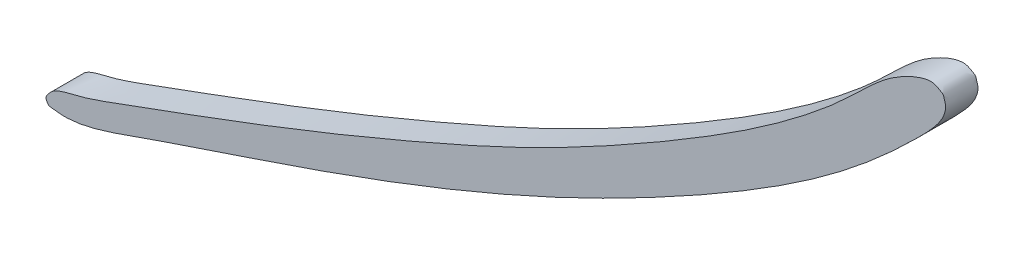
ISO-10303-21;
HEADER;
FILE_DESCRIPTION(('STEP AP214'),'2;1');
FILE_NAME('part.step','',(''),(''),'','','');
FILE_SCHEMA(('AUTOMOTIVE_DESIGN { 1 0 10303 214 1 1 1 1 }'));
ENDSEC;
DATA;
#1=APPLICATION_CONTEXT('core data for automotive mechanical design processes');
#2=APPLICATION_PROTOCOL_DEFINITION('international standard','automotive_design',2000,#1);
#3=PRODUCT_CONTEXT('',#1,'mechanical');
#4=PRODUCT('Part','Part','',(#3));
#5=PRODUCT_RELATED_PRODUCT_CATEGORY('part','',(#4));
#6=PRODUCT_DEFINITION_FORMATION('','',#4);
#7=PRODUCT_DEFINITION_CONTEXT('part definition',#1,'design');
#8=PRODUCT_DEFINITION('design','',#6,#7);
#9=PRODUCT_DEFINITION_SHAPE('','',#8);
#10=(LENGTH_UNIT() NAMED_UNIT(*) SI_UNIT(.MILLI.,.METRE.));
#11=(NAMED_UNIT(*) PLANE_ANGLE_UNIT() SI_UNIT($,.RADIAN.));
#12=(NAMED_UNIT(*) SI_UNIT($,.STERADIAN.) SOLID_ANGLE_UNIT());
#13=UNCERTAINTY_MEASURE_WITH_UNIT(LENGTH_MEASURE(1.E-05),#10,'distance_accuracy_value','');
#14=(GEOMETRIC_REPRESENTATION_CONTEXT(3) GLOBAL_UNCERTAINTY_ASSIGNED_CONTEXT((#13)) GLOBAL_UNIT_ASSIGNED_CONTEXT((#10,
#11,#12)) REPRESENTATION_CONTEXT('',''));
#15=CARTESIAN_POINT('',(0.,0.,0.));
#16=DIRECTION('',(0.,0.,1.));
#17=DIRECTION('',(1.,0.,0.));
#18=AXIS2_PLACEMENT_3D('',#15,#16,#17);
#19=CARTESIAN_POINT('',(102.057733307676,0.,140.));
#20=CARTESIAN_POINT('',(101.962676141197,0.142516644317839,140.));
#21=CARTESIAN_POINT('',(101.821941702377,0.24010677990998,140.));
#22=CARTESIAN_POINT('',(101.535030322665,0.418667279109253,140.));
#23=CARTESIAN_POINT('',(101.386294801414,0.498837562727453,140.));
#24=CARTESIAN_POINT('',(101.092939539661,0.666279611016921,140.));
#25=CARTESIAN_POINT('',(100.947667564728,0.752425992501434,140.));
#26=CARTESIAN_POINT('',(100.650509262064,0.913306169634957,140.));
#27=CARTESIAN_POINT('',(100.499177263178,0.988329365892847,140.));
#28=CARTESIAN_POINT('',(100.191666683993,1.12215752572723,140.));
#29=CARTESIAN_POINT('',(100.034994525604,1.18058485724746,140.));
#30=CARTESIAN_POINT('',(99.7111281294442,1.26682510236769,140.));
#31=CARTESIAN_POINT('',(99.5427705351879,1.29581185455209,140.));
#32=CARTESIAN_POINT('',(99.0366140120345,1.34446390544908,140.));
#33=CARTESIAN_POINT('',(98.7015714964061,1.32743816267723,140.));
#34=CARTESIAN_POINT('',(98.0338138981081,1.24532493808534,140.));
#35=CARTESIAN_POINT('',(97.7009011280452,1.1785990423327,140.));
#36=CARTESIAN_POINT('',(97.0480807716276,1.02268907596653,140.));
#37=CARTESIAN_POINT('',(96.7263196816451,0.931947806175763,140.));
#38=CARTESIAN_POINT('',(95.7733663415602,0.62581325787824,140.));
#39=CARTESIAN_POINT('',(95.1533423115266,0.379704265719774,140.));
#40=CARTESIAN_POINT('',(93.9278177514043,-0.152457385786442,140.));
#41=CARTESIAN_POINT('',(93.3216382307498,-0.442437948989211,140.));
#42=CARTESIAN_POINT('',(92.1336428585738,-1.05752382836864,140.));
#43=CARTESIAN_POINT('',(91.551936655469,-1.38178134880864,140.));
#44=CARTESIAN_POINT('',(89.8410991984617,-2.40117115633311,140.));
#45=CARTESIAN_POINT('',(88.748132347433,-3.145481629072,140.));
#46=CARTESIAN_POINT('',(85.6046288443026,-5.56253280956003,140.));
#47=CARTESIAN_POINT('',(83.676333240927,-7.40170155492786,140.));
#48=CARTESIAN_POINT('',(80.8008864217277,-10.1827260597335,140.));
#49=CARTESIAN_POINT('',(79.8434632554264,-11.1111501086519,140.));
#50=CARTESIAN_POINT('',(77.9094426741411,-12.9423648628248,140.));
#51=CARTESIAN_POINT('',(76.9345108605818,-13.8473822490008,140.));
#52=CARTESIAN_POINT('',(73.9682368812663,-16.506983283827,140.));
#53=CARTESIAN_POINT('',(71.9382678261279,-18.2099280731618,140.));
#54=CARTESIAN_POINT('',(67.8100442077678,-21.5245292824694,140.));
#55=CARTESIAN_POINT('',(65.7117213207824,-23.1360943629306,140.));
#56=CARTESIAN_POINT('',(61.4641506556757,-26.2911449209881,140.));
#57=CARTESIAN_POINT('',(59.3130472963583,-27.8321497407355,140.));
#58=CARTESIAN_POINT('',(54.9577964188229,-30.8432466066985,140.));
#59=CARTESIAN_POINT('',(52.75463560697,-32.314657744148,140.));
#60=CARTESIAN_POINT('',(48.3089080789626,-35.2047997235071,140.));
#61=CARTESIAN_POINT('',(46.0664851938051,-36.6237228477552,140.));
#62=CARTESIAN_POINT('',(41.5526254908894,-39.4227814432014,140.));
#63=CARTESIAN_POINT('',(39.2802080198432,-40.8028726390609,140.));
#64=CARTESIAN_POINT('',(32.4308879126295,-44.8901584419507,140.));
#65=CARTESIAN_POINT('',(27.8223787288117,-47.5443673312823,140.));
#66=CARTESIAN_POINT('',(18.5400631658067,-52.7320945639716,140.));
#67=CARTESIAN_POINT('',(13.8663029099355,-55.2650712351752,140.));
#68=CARTESIAN_POINT('',(4.43178301771482,-60.1685483665272,140.));
#69=CARTESIAN_POINT('',(-0.332083154591981,-62.5354473233724,140.));
#70=CARTESIAN_POINT('',(-9.93624818092265,-67.0972649941052,140.));
#71=CARTESIAN_POINT('',(-14.777734120957,-69.2932642124302,140.));
#72=CARTESIAN_POINT('',(-24.506189615508,-73.5872509634414,140.));
#73=CARTESIAN_POINT('',(-29.3913556935983,-75.6875684559242,140.));
#74=CARTESIAN_POINT('',(-39.1877424269124,-79.8238595987676,140.));
#75=CARTESIAN_POINT('',(-44.099759835072,-81.8596834877531,140.));
#76=CARTESIAN_POINT('',(-53.9584554310622,-85.847040334263,140.));
#77=CARTESIAN_POINT('',(-58.9047472520571,-87.7972891259917,140.));
#78=CARTESIAN_POINT('',(-68.8263537446599,-91.6233975453181,140.));
#79=CARTESIAN_POINT('',(-73.8013270461344,-93.5003970761533,140.));
#80=CARTESIAN_POINT('',(-81.2739052523245,-96.2886358795814,140.));
#81=CARTESIAN_POINT('',(-83.7663990247296,-97.2136662720909,140.));
#82=CARTESIAN_POINT('',(-88.7521676174373,-99.0616086376601,140.));
#83=CARTESIAN_POINT('',(-91.2454447186618,-99.9845238785492,140.));
#84=CARTESIAN_POINT('',(-96.2347103566942,-101.82299836821,140.));
#85=CARTESIAN_POINT('',(-98.7309301209679,-102.73794484647,140.));
#86=CARTESIAN_POINT('',(-102.479303181382,-104.099222107488,140.));
#87=CARTESIAN_POINT('',(-103.728682282879,-104.553198484821,140.));
#88=CARTESIAN_POINT('',(-106.231827459639,-105.449021148113,140.));
#89=CARTESIAN_POINT('',(-107.486907124822,-105.886799692826,140.));
#90=CARTESIAN_POINT('',(-110.018323693571,-106.688455667058,140.));
#91=CARTESIAN_POINT('',(-111.294468980965,-107.05373464731,140.));
#92=CARTESIAN_POINT('',(-113.228708101294,-107.533459844928,140.));
#93=CARTESIAN_POINT('',(-113.876376303375,-107.683416334939,140.));
#94=CARTESIAN_POINT('',(-115.159808459549,-108.023875838968,140.));
#95=CARTESIAN_POINT('',(-115.796585709176,-108.211082080298,140.));
#96=CARTESIAN_POINT('',(-116.720341410338,-108.570387874491,140.));
#97=CARTESIAN_POINT('',(-117.022690877312,-108.704511531072,140.));
#98=CARTESIAN_POINT('',(-117.607895975314,-109.023006667351,140.));
#99=CARTESIAN_POINT('',(-117.886592166604,-109.206094192118,140.));
#100=CARTESIAN_POINT('',(-118.388037415295,-109.627595019604,140.));
#101=CARTESIAN_POINT('',(-118.61437727197,-109.865589485727,140.));
#102=CARTESIAN_POINT('',(-118.932477248965,-110.246503404859,140.));
#103=CARTESIAN_POINT('',(-119.034205275818,-110.378292267774,140.));
#104=CARTESIAN_POINT('',(-119.236541038944,-110.641716636127,140.));
#105=CARTESIAN_POINT('',(-119.337825602485,-110.773347395761,140.));
#106=CARTESIAN_POINT('',(-119.518799463527,-111.051678805721,140.));
#107=CARTESIAN_POINT('',(-119.602114066893,-111.201877195743,140.));
#108=CARTESIAN_POINT('',(-119.648215340564,-111.535584809531,140.));
#109=CARTESIAN_POINT('',(-119.608346981636,-111.70434587511,140.));
#110=CARTESIAN_POINT('',(-119.493582657096,-112.015542970277,140.));
#111=CARTESIAN_POINT('',(-119.421734302809,-112.16507824468,140.));
#112=CARTESIAN_POINT('',(-119.301432101046,-112.384129545218,140.));
#113=CARTESIAN_POINT('',(-119.258518092987,-112.455602565269,140.));
#114=CARTESIAN_POINT('',(-119.163389076837,-112.59180522141,140.));
#115=CARTESIAN_POINT('',(-119.110042110579,-112.657209740684,140.));
#116=CARTESIAN_POINT('',(-118.988075313533,-112.769368957982,140.));
#117=CARTESIAN_POINT('',(-118.918727406085,-112.817162055145,140.));
#118=CARTESIAN_POINT('',(-118.768831348743,-112.889069636095,140.));
#119=CARTESIAN_POINT('',(-118.689027826353,-112.911724668703,140.));
#120=CARTESIAN_POINT('',(-118.443026205126,-112.958296532501,140.));
#121=CARTESIAN_POINT('',(-118.276588644351,-112.964481115223,140.));
#122=CARTESIAN_POINT('',(-117.778801575783,-112.998603156016,140.));
#123=CARTESIAN_POINT('',(-117.44866238398,-113.037673658146,140.));
#124=CARTESIAN_POINT('',(-116.788188102577,-113.121133681609,140.));
#125=CARTESIAN_POINT('',(-116.457962102576,-113.165194724771,140.));
#126=CARTESIAN_POINT('',(-115.797359763013,-113.221860420003,140.));
#127=CARTESIAN_POINT('',(-115.466985822682,-113.234967076981,140.));
#128=CARTESIAN_POINT('',(-114.475695765086,-113.239085957723,140.));
#129=CARTESIAN_POINT('',(-113.814618353362,-113.196349636067,140.));
#130=CARTESIAN_POINT('',(-112.492254325882,-113.067104058087,140.));
#131=CARTESIAN_POINT('',(-111.831495728637,-112.979194331104,140.));
#132=CARTESIAN_POINT('',(-110.525918678127,-112.7632285738,140.));
#133=CARTESIAN_POINT('',(-109.878981356204,-112.634835257558,140.));
#134=CARTESIAN_POINT('',(-107.952833541055,-112.198503141662,140.));
#135=CARTESIAN_POINT('',(-106.687694809474,-111.841478573406,140.));
#136=CARTESIAN_POINT('',(-104.173016510138,-111.073015713485,140.));
#137=CARTESIAN_POINT('',(-102.923874901132,-110.660189243739,140.));
#138=CARTESIAN_POINT('',(-99.186048980755,-109.388226485225,140.));
#139=CARTESIAN_POINT('',(-96.7048470391096,-108.503456947671,140.));
#140=CARTESIAN_POINT('',(-91.7338401473932,-106.761691871831,140.));
#141=CARTESIAN_POINT('',(-89.2453108158727,-105.899386574664,140.));
#142=CARTESIAN_POINT('',(-81.7674895326809,-103.348392865064,140.));
#143=CARTESIAN_POINT('',(-76.7690399043289,-101.686710939639,140.));
#144=CARTESIAN_POINT('',(-66.7794608125337,-98.3420297338285,140.));
#145=CARTESIAN_POINT('',(-61.7878155794341,-96.6605676486596,140.));
#146=CARTESIAN_POINT('',(-46.8522683981065,-91.5019174216151,140.));
#147=CARTESIAN_POINT('',(-36.9467309109251,-87.908197944574,140.));
#148=CARTESIAN_POINT('',(-22.2294430761429,-82.1619343514593,140.));
#149=CARTESIAN_POINT('',(-17.3460317200841,-80.1868058744148,140.));
#150=CARTESIAN_POINT('',(-7.63373774164566,-76.1049596199435,140.));
#151=CARTESIAN_POINT('',(-2.80692055683079,-73.9991204608374,140.));
#152=CARTESIAN_POINT('',(11.5703617704928,-67.4532572112962,140.));
#153=CARTESIAN_POINT('',(21.0233270248259,-62.7850317350021,140.));
#154=CARTESIAN_POINT('',(34.9807224476126,-55.3764898608674,140.));
#155=CARTESIAN_POINT('',(39.5922357870787,-52.8430342290804,140.));
#156=CARTESIAN_POINT('',(48.722455352081,-47.6312150008303,140.));
#157=CARTESIAN_POINT('',(53.241786538152,-44.9538272105877,140.));
#158=CARTESIAN_POINT('',(62.1460169830506,-39.3891511586884,140.));
#159=CARTESIAN_POINT('',(66.5302023875438,-36.5007482930509,140.));
#160=CARTESIAN_POINT('',(75.0925308524823,-30.4022304057901,140.));
#161=CARTESIAN_POINT('',(79.2688872930178,-27.1889854464808,140.));
#162=CARTESIAN_POINT('',(85.3435053638941,-22.0736074220783,140.));
#163=CARTESIAN_POINT('',(87.3303562392506,-20.3256183322959,140.));
#164=CARTESIAN_POINT('',(91.234859362927,-16.7516305573011,140.));
#165=CARTESIAN_POINT('',(93.1541851384151,-14.9280868951107,140.));
#166=CARTESIAN_POINT('',(95.9837594093325,-12.142691409223,140.));
#167=CARTESIAN_POINT('',(96.9190657243905,-11.2061302073817,140.));
#168=CARTESIAN_POINT('',(98.2900691043272,-9.7705527381082,140.));
#169=CARTESIAN_POINT('',(98.74077637573,-9.28522457741888,140.));
#170=CARTESIAN_POINT('',(99.6176822654926,-8.29504460302253,140.));
#171=CARTESIAN_POINT('',(100.045142501861,-7.79125220272016,140.));
#172=CARTESIAN_POINT('',(100.851408348022,-6.74514981026008,140.));
#173=CARTESIAN_POINT('',(101.232029632026,-6.20058231509911,140.));
#174=CARTESIAN_POINT('',(101.733723703415,-5.34210590975484,140.));
#175=CARTESIAN_POINT('',(101.888607892713,-5.04974645526602,140.));
#176=CARTESIAN_POINT('',(102.165860600153,-4.44869842635026,140.));
#177=CARTESIAN_POINT('',(102.288522969304,-4.13834481496648,140.));
#178=CARTESIAN_POINT('',(102.493253885496,-3.50824972925251,140.));
#179=CARTESIAN_POINT('',(102.575182631375,-3.18848595898934,140.));
#180=CARTESIAN_POINT('',(102.645792314535,-2.69677473406768,140.));
#181=CARTESIAN_POINT('',(102.660388952861,-2.52919459256812,140.));
#182=CARTESIAN_POINT('',(102.665394982944,-2.19717752690158,140.));
#183=CARTESIAN_POINT('',(102.656086130014,-2.03345252852174,140.));
#184=CARTESIAN_POINT('',(102.581581694767,-1.55128222137112,140.));
#185=CARTESIAN_POINT('',(102.472222393365,-1.241374882578,140.));
#186=CARTESIAN_POINT('',(102.318443008268,-0.774530439186348,140.));
#187=CARTESIAN_POINT('',(102.274459928558,-0.617039558874887,140.));
#188=CARTESIAN_POINT('',(102.209966655229,-0.379987776887736,140.));
#189=CARTESIAN_POINT('',(102.189036118981,-0.300779113975077,140.));
#190=CARTESIAN_POINT('',(102.136534605629,-0.145952280092756,140.));
#191=CARTESIAN_POINT('',(102.105261890916,-0.0712583221589129,140.));
#192=CARTESIAN_POINT('',(102.057733307676,0.,140.));
#193=B_SPLINE_CURVE_WITH_KNOTS('',3,(#19,#20,#21,#22,#23,#24,#25,#26,#27,#28,#29,#30,#31,#32,
#33,#34,#35,#36,#37,#38,#39,#40,#41,#42,#43,#44,#45,#46,#47,#48,#49,#50,#51,#52,#53,#54,#55,#56,
#57,#58,#59,#60,#61,#62,#63,#64,#65,#66,#67,#68,#69,#70,#71,#72,#73,#74,#75,#76,#77,#78,#79,#80,
#81,#82,#83,#84,#85,#86,#87,#88,#89,#90,#91,#92,#93,#94,#95,#96,#97,#98,#99,#100,#101,#102,#103,
#104,#105,#106,#107,#108,#109,#110,#111,#112,#113,#114,#115,#116,#117,#118,#119,#120,#121,#122,
#123,#124,#125,#126,#127,#128,#129,#130,#131,#132,#133,#134,#135,#136,#137,#138,#139,#140,#141,
#142,#143,#144,#145,#146,#147,#148,#149,#150,#151,#152,#153,#154,#155,#156,#157,#158,#159,#160,
#161,#162,#163,#164,#165,#166,#167,#168,#169,#170,#171,#172,#173,#174,#175,#176,#177,#178,#179,
#180,#181,#182,#183,#184,#185,#186,#187,#188,#189,#190,#191,#192),.UNSPECIFIED.,.T.,.F.,(4,2,2,
2,2,2,2,2,2,2,2,2,2,2,2,2,2,2,2,2,2,2,2,2,2,2,2,2,2,2,2,2,2,2,2,2,2,2,2,2,2,2,2,2,2,2,2,2,2,2,2,
2,2,2,2,2,2,2,2,2,2,2,2,2,2,2,2,2,2,2,2,2,2,2,2,2,2,2,2,2,2,2,2,2,2,2,4),(0.,
0.000976562499999994,0.00195312499999999,0.00292968749999998,0.00390624999999998,
0.00488281249999997,0.00585937499999996,0.00781249999999995,0.00976562499999994,
0.0117187499999999,0.015625,0.01953125,0.0234375000000001,0.0312500000000001,0.0468750000000002,
0.0546875000000002,0.0625000000000002,0.0781250000000002,0.0937500000000001,0.109375,0.125,
0.140625,0.15625,0.1875,0.21875,0.25,0.28125,0.3125,0.343749999999999,0.374999999999999,
0.406249999999999,0.421874999999999,0.437499999999999,0.453124999999999,0.460937499999999,
0.468749999999999,0.476562499999999,0.480468749999999,0.484374999999999,0.486328124999999,
0.488281249999999,0.490234374999999,0.491210937499999,0.492187499999999,0.493164062499999,
0.494140624999999,0.495117187499999,0.495605468749999,0.496093749999999,0.496582031249999,
0.497070312499999,0.498046874999999,0.499999999999999,0.501953124999999,0.503906249999999,
0.507812499999999,0.511718749999999,0.515624999999999,0.523437499999999,0.531249999999999,
0.546874999999999,0.562499999999999,0.593749999999999,0.624999999999999,0.687499999999999,
0.718749999999999,0.749999999999999,0.8125,0.84375,0.875,0.90625,0.9375,0.953125,0.96875,
0.9765625,0.98046875,0.984375,0.98828125,0.990234375,0.9921875,0.994140625,0.9951171875,
0.99609375,0.998046875,0.9990234375,0.99951171875,1.),.UNSPECIFIED.);
#194=DIRECTION('',(0.,0.,-1.));
#195=VECTOR('',#194,1.);
#196=SURFACE_OF_LINEAR_EXTRUSION('',#193,#195);
#197=CARTESIAN_POINT('',(102.057733307676,0.,140.));
#198=CARTESIAN_POINT('',(102.105261890916,-0.0712583221589129,140.));
#199=CARTESIAN_POINT('',(102.136534605629,-0.145952280092756,140.));
#200=CARTESIAN_POINT('',(102.189036118981,-0.300779113975077,140.));
#201=CARTESIAN_POINT('',(102.209966655229,-0.379987776887736,140.));
#202=CARTESIAN_POINT('',(102.274459928558,-0.617039558874887,140.));
#203=CARTESIAN_POINT('',(102.318443008268,-0.774530439186348,140.));
#204=CARTESIAN_POINT('',(102.472222393365,-1.241374882578,140.));
#205=CARTESIAN_POINT('',(102.581581694767,-1.55128222137112,140.));
#206=CARTESIAN_POINT('',(102.656086130014,-2.03345252852174,140.));
#207=CARTESIAN_POINT('',(102.665394982944,-2.19717752690158,140.));
#208=CARTESIAN_POINT('',(102.660388952861,-2.52919459256812,140.));
#209=CARTESIAN_POINT('',(102.645792314535,-2.69677473406768,140.));
#210=CARTESIAN_POINT('',(102.575182631375,-3.18848595898934,140.));
#211=CARTESIAN_POINT('',(102.493253885496,-3.50824972925251,140.));
#212=CARTESIAN_POINT('',(102.288522969304,-4.13834481496648,140.));
#213=CARTESIAN_POINT('',(102.165860600153,-4.44869842635026,140.));
#214=CARTESIAN_POINT('',(101.888607892713,-5.04974645526602,140.));
#215=CARTESIAN_POINT('',(101.733723703415,-5.34210590975484,140.));
#216=CARTESIAN_POINT('',(101.232029632026,-6.20058231509911,140.));
#217=CARTESIAN_POINT('',(100.851408348022,-6.74514981026008,140.));
#218=CARTESIAN_POINT('',(100.045142501861,-7.79125220272016,140.));
#219=CARTESIAN_POINT('',(99.6176822654926,-8.29504460302253,140.));
#220=CARTESIAN_POINT('',(98.74077637573,-9.28522457741888,140.));
#221=CARTESIAN_POINT('',(98.2900691043272,-9.7705527381082,140.));
#222=CARTESIAN_POINT('',(96.9190657243905,-11.2061302073817,140.));
#223=CARTESIAN_POINT('',(95.9837594093325,-12.142691409223,140.));
#224=CARTESIAN_POINT('',(93.1541851384151,-14.9280868951107,140.));
#225=CARTESIAN_POINT('',(91.234859362927,-16.7516305573011,140.));
#226=CARTESIAN_POINT('',(87.3303562392506,-20.3256183322959,140.));
#227=CARTESIAN_POINT('',(85.3435053638941,-22.0736074220783,140.));
#228=CARTESIAN_POINT('',(79.2688872930178,-27.1889854464808,140.));
#229=CARTESIAN_POINT('',(75.0925308524823,-30.4022304057901,140.));
#230=CARTESIAN_POINT('',(66.5302023875438,-36.5007482930509,140.));
#231=CARTESIAN_POINT('',(62.1460169830506,-39.3891511586884,140.));
#232=CARTESIAN_POINT('',(53.241786538152,-44.9538272105877,140.));
#233=CARTESIAN_POINT('',(48.722455352081,-47.6312150008303,140.));
#234=CARTESIAN_POINT('',(39.5922357870787,-52.8430342290804,140.));
#235=CARTESIAN_POINT('',(34.9807224476126,-55.3764898608674,140.));
#236=CARTESIAN_POINT('',(21.0233270248259,-62.7850317350021,140.));
#237=CARTESIAN_POINT('',(11.5703617704928,-67.4532572112962,140.));
#238=CARTESIAN_POINT('',(-2.80692055683079,-73.9991204608374,140.));
#239=CARTESIAN_POINT('',(-7.63373774164566,-76.1049596199435,140.));
#240=CARTESIAN_POINT('',(-17.3460317200841,-80.1868058744148,140.));
#241=CARTESIAN_POINT('',(-22.2294430761429,-82.1619343514593,140.));
#242=CARTESIAN_POINT('',(-36.9467309109251,-87.908197944574,140.));
#243=CARTESIAN_POINT('',(-46.8522683981065,-91.5019174216151,140.));
#244=CARTESIAN_POINT('',(-61.7878155794341,-96.6605676486596,140.));
#245=CARTESIAN_POINT('',(-66.7794608125337,-98.3420297338285,140.));
#246=CARTESIAN_POINT('',(-76.7690399043289,-101.686710939639,140.));
#247=CARTESIAN_POINT('',(-81.7674895326809,-103.348392865064,140.));
#248=CARTESIAN_POINT('',(-89.2453108158727,-105.899386574664,140.));
#249=CARTESIAN_POINT('',(-91.7338401473932,-106.761691871831,140.));
#250=CARTESIAN_POINT('',(-96.7048470391096,-108.503456947671,140.));
#251=CARTESIAN_POINT('',(-99.186048980755,-109.388226485225,140.));
#252=CARTESIAN_POINT('',(-102.923874901132,-110.660189243739,140.));
#253=CARTESIAN_POINT('',(-104.173016510138,-111.073015713485,140.));
#254=CARTESIAN_POINT('',(-106.687694809474,-111.841478573406,140.));
#255=CARTESIAN_POINT('',(-107.952833541055,-112.198503141662,140.));
#256=CARTESIAN_POINT('',(-109.878981356204,-112.634835257558,140.));
#257=CARTESIAN_POINT('',(-110.525918678127,-112.7632285738,140.));
#258=CARTESIAN_POINT('',(-111.831495728637,-112.979194331104,140.));
#259=CARTESIAN_POINT('',(-112.492254325882,-113.067104058087,140.));
#260=CARTESIAN_POINT('',(-113.814618353362,-113.196349636067,140.));
#261=CARTESIAN_POINT('',(-114.475695765086,-113.239085957723,140.));
#262=CARTESIAN_POINT('',(-115.466985822682,-113.234967076981,140.));
#263=CARTESIAN_POINT('',(-115.797359763013,-113.221860420003,140.));
#264=CARTESIAN_POINT('',(-116.457962102576,-113.165194724771,140.));
#265=CARTESIAN_POINT('',(-116.788188102577,-113.121133681609,140.));
#266=CARTESIAN_POINT('',(-117.44866238398,-113.037673658146,140.));
#267=CARTESIAN_POINT('',(-117.778801575783,-112.998603156016,140.));
#268=CARTESIAN_POINT('',(-118.276588644351,-112.964481115223,140.));
#269=CARTESIAN_POINT('',(-118.443026205126,-112.958296532501,140.));
#270=CARTESIAN_POINT('',(-118.689027826353,-112.911724668703,140.));
#271=CARTESIAN_POINT('',(-118.768831348743,-112.889069636095,140.));
#272=CARTESIAN_POINT('',(-118.918727406085,-112.817162055145,140.));
#273=CARTESIAN_POINT('',(-118.988075313533,-112.769368957982,140.));
#274=CARTESIAN_POINT('',(-119.110042110579,-112.657209740684,140.));
#275=CARTESIAN_POINT('',(-119.163389076837,-112.59180522141,140.));
#276=CARTESIAN_POINT('',(-119.258518092987,-112.455602565269,140.));
#277=CARTESIAN_POINT('',(-119.301432101046,-112.384129545218,140.));
#278=CARTESIAN_POINT('',(-119.421734302809,-112.16507824468,140.));
#279=CARTESIAN_POINT('',(-119.493582657096,-112.015542970277,140.));
#280=CARTESIAN_POINT('',(-119.608346981636,-111.70434587511,140.));
#281=CARTESIAN_POINT('',(-119.648215340564,-111.535584809531,140.));
#282=CARTESIAN_POINT('',(-119.602114066893,-111.201877195743,140.));
#283=CARTESIAN_POINT('',(-119.518799463527,-111.051678805721,140.));
#284=CARTESIAN_POINT('',(-119.337825602485,-110.773347395761,140.));
#285=CARTESIAN_POINT('',(-119.236541038944,-110.641716636127,140.));
#286=CARTESIAN_POINT('',(-119.034205275818,-110.378292267774,140.));
#287=CARTESIAN_POINT('',(-118.932477248965,-110.246503404859,140.));
#288=CARTESIAN_POINT('',(-118.61437727197,-109.865589485727,140.));
#289=CARTESIAN_POINT('',(-118.388037415295,-109.627595019604,140.));
#290=CARTESIAN_POINT('',(-117.886592166604,-109.206094192118,140.));
#291=CARTESIAN_POINT('',(-117.607895975314,-109.023006667351,140.));
#292=CARTESIAN_POINT('',(-117.022690877312,-108.704511531072,140.));
#293=CARTESIAN_POINT('',(-116.720341410338,-108.570387874491,140.));
#294=CARTESIAN_POINT('',(-115.796585709176,-108.211082080298,140.));
#295=CARTESIAN_POINT('',(-115.159808459549,-108.023875838968,140.));
#296=CARTESIAN_POINT('',(-113.876376303375,-107.683416334939,140.));
#297=CARTESIAN_POINT('',(-113.228708101294,-107.533459844928,140.));
#298=CARTESIAN_POINT('',(-111.294468980965,-107.05373464731,140.));
#299=CARTESIAN_POINT('',(-110.018323693571,-106.688455667058,140.));
#300=CARTESIAN_POINT('',(-107.486907124822,-105.886799692826,140.));
#301=CARTESIAN_POINT('',(-106.231827459639,-105.449021148113,140.));
#302=CARTESIAN_POINT('',(-103.728682282879,-104.553198484821,140.));
#303=CARTESIAN_POINT('',(-102.479303181382,-104.099222107488,140.));
#304=CARTESIAN_POINT('',(-98.7309301209679,-102.73794484647,140.));
#305=CARTESIAN_POINT('',(-96.2347103566942,-101.82299836821,140.));
#306=CARTESIAN_POINT('',(-91.2454447186618,-99.9845238785492,140.));
#307=CARTESIAN_POINT('',(-88.7521676174373,-99.0616086376601,140.));
#308=CARTESIAN_POINT('',(-83.7663990247296,-97.2136662720909,140.));
#309=CARTESIAN_POINT('',(-81.2739052523245,-96.2886358795814,140.));
#310=CARTESIAN_POINT('',(-73.8013270461344,-93.5003970761533,140.));
#311=CARTESIAN_POINT('',(-68.8263537446599,-91.6233975453181,140.));
#312=CARTESIAN_POINT('',(-58.9047472520571,-87.7972891259917,140.));
#313=CARTESIAN_POINT('',(-53.9584554310622,-85.847040334263,140.));
#314=CARTESIAN_POINT('',(-44.099759835072,-81.8596834877531,140.));
#315=CARTESIAN_POINT('',(-39.1877424269124,-79.8238595987676,140.));
#316=CARTESIAN_POINT('',(-29.3913556935983,-75.6875684559242,140.));
#317=CARTESIAN_POINT('',(-24.506189615508,-73.5872509634414,140.));
#318=CARTESIAN_POINT('',(-14.777734120957,-69.2932642124302,140.));
#319=CARTESIAN_POINT('',(-9.93624818092265,-67.0972649941052,140.));
#320=CARTESIAN_POINT('',(-0.332083154591981,-62.5354473233724,140.));
#321=CARTESIAN_POINT('',(4.43178301771482,-60.1685483665272,140.));
#322=CARTESIAN_POINT('',(13.8663029099355,-55.2650712351752,140.));
#323=CARTESIAN_POINT('',(18.5400631658067,-52.7320945639716,140.));
#324=CARTESIAN_POINT('',(27.8223787288117,-47.5443673312823,140.));
#325=CARTESIAN_POINT('',(32.4308879126295,-44.8901584419507,140.));
#326=CARTESIAN_POINT('',(39.2802080198432,-40.8028726390609,140.));
#327=CARTESIAN_POINT('',(41.5526254908894,-39.4227814432014,140.));
#328=CARTESIAN_POINT('',(46.0664851938051,-36.6237228477552,140.));
#329=CARTESIAN_POINT('',(48.3089080789626,-35.2047997235071,140.));
#330=CARTESIAN_POINT('',(52.75463560697,-32.314657744148,140.));
#331=CARTESIAN_POINT('',(54.9577964188229,-30.8432466066985,140.));
#332=CARTESIAN_POINT('',(59.3130472963583,-27.8321497407355,140.));
#333=CARTESIAN_POINT('',(61.4641506556757,-26.2911449209881,140.));
#334=CARTESIAN_POINT('',(65.7117213207824,-23.1360943629306,140.));
#335=CARTESIAN_POINT('',(67.8100442077678,-21.5245292824694,140.));
#336=CARTESIAN_POINT('',(71.9382678261279,-18.2099280731618,140.));
#337=CARTESIAN_POINT('',(73.9682368812663,-16.506983283827,140.));
#338=CARTESIAN_POINT('',(76.9345108605818,-13.8473822490008,140.));
#339=CARTESIAN_POINT('',(77.9094426741411,-12.9423648628248,140.));
#340=CARTESIAN_POINT('',(79.8434632554264,-11.1111501086519,140.));
#341=CARTESIAN_POINT('',(80.8008864217277,-10.1827260597335,140.));
#342=CARTESIAN_POINT('',(83.676333240927,-7.40170155492786,140.));
#343=CARTESIAN_POINT('',(85.6046288443026,-5.56253280956003,140.));
#344=CARTESIAN_POINT('',(88.748132347433,-3.145481629072,140.));
#345=CARTESIAN_POINT('',(89.8410991984617,-2.40117115633311,140.));
#346=CARTESIAN_POINT('',(91.551936655469,-1.38178134880864,140.));
#347=CARTESIAN_POINT('',(92.1336428585738,-1.05752382836864,140.));
#348=CARTESIAN_POINT('',(93.3216382307498,-0.442437948989211,140.));
#349=CARTESIAN_POINT('',(93.9278177514043,-0.152457385786442,140.));
#350=CARTESIAN_POINT('',(95.1533423115266,0.379704265719774,140.));
#351=CARTESIAN_POINT('',(95.7733663415602,0.62581325787824,140.));
#352=CARTESIAN_POINT('',(96.7263196816451,0.931947806175763,140.));
#353=CARTESIAN_POINT('',(97.0480807716276,1.02268907596653,140.));
#354=CARTESIAN_POINT('',(97.7009011280452,1.1785990423327,140.));
#355=CARTESIAN_POINT('',(98.0338138981081,1.24532493808534,140.));
#356=CARTESIAN_POINT('',(98.7015714964061,1.32743816267723,140.));
#357=CARTESIAN_POINT('',(99.0366140120345,1.34446390544908,140.));
#358=CARTESIAN_POINT('',(99.5427705351879,1.29581185455209,140.));
#359=CARTESIAN_POINT('',(99.7111281294442,1.26682510236769,140.));
#360=CARTESIAN_POINT('',(100.034994525604,1.18058485724746,140.));
#361=CARTESIAN_POINT('',(100.191666683993,1.12215752572723,140.));
#362=CARTESIAN_POINT('',(100.499177263178,0.988329365892847,140.));
#363=CARTESIAN_POINT('',(100.650509262064,0.913306169634957,140.));
#364=CARTESIAN_POINT('',(100.947667564728,0.752425992501434,140.));
#365=CARTESIAN_POINT('',(101.092939539661,0.666279611016921,140.));
#366=CARTESIAN_POINT('',(101.386294801414,0.498837562727453,140.));
#367=CARTESIAN_POINT('',(101.535030322665,0.418667279109253,140.));
#368=CARTESIAN_POINT('',(101.821941702377,0.24010677990998,140.));
#369=CARTESIAN_POINT('',(101.962676141197,0.142516644317839,140.));
#370=CARTESIAN_POINT('',(102.057733307676,0.,140.));
#371=B_SPLINE_CURVE_WITH_KNOTS('',3,(#197,#198,#199,#200,#201,#202,#203,#204,#205,#206,#207,
#208,#209,#210,#211,#212,#213,#214,#215,#216,#217,#218,#219,#220,#221,#222,#223,#224,#225,#226,
#227,#228,#229,#230,#231,#232,#233,#234,#235,#236,#237,#238,#239,#240,#241,#242,#243,#244,#245,
#246,#247,#248,#249,#250,#251,#252,#253,#254,#255,#256,#257,#258,#259,#260,#261,#262,#263,#264,
#265,#266,#267,#268,#269,#270,#271,#272,#273,#274,#275,#276,#277,#278,#279,#280,#281,#282,#283,
#284,#285,#286,#287,#288,#289,#290,#291,#292,#293,#294,#295,#296,#297,#298,#299,#300,#301,#302,
#303,#304,#305,#306,#307,#308,#309,#310,#311,#312,#313,#314,#315,#316,#317,#318,#319,#320,#321,
#322,#323,#324,#325,#326,#327,#328,#329,#330,#331,#332,#333,#334,#335,#336,#337,#338,#339,#340,
#341,#342,#343,#344,#345,#346,#347,#348,#349,#350,#351,#352,#353,#354,#355,#356,#357,#358,#359,
#360,#361,#362,#363,#364,#365,#366,#367,#368,#369,#370),.UNSPECIFIED.,.T.,.F.,(4,2,2,2,2,2,2,2,
2,2,2,2,2,2,2,2,2,2,2,2,2,2,2,2,2,2,2,2,2,2,2,2,2,2,2,2,2,2,2,2,2,2,2,2,2,2,2,2,2,2,2,2,2,2,2,2,
2,2,2,2,2,2,2,2,2,2,2,2,2,2,2,2,2,2,2,2,2,2,2,2,2,2,2,2,2,2,4),(0.,0.00048828125,0.0009765625,
0.001953125,0.00390625,0.0048828125,0.005859375,0.0078125,0.00976562499999989,
0.0117187499999999,0.015625,0.0195312500000001,0.0234375000000002,0.0312500000000002,
0.0468750000000002,0.0625000000000003,0.0937500000000003,0.125,0.15625,0.1875,0.250000000000001,
0.281250000000001,0.312500000000001,0.375000000000001,0.406250000000001,0.437500000000001,
0.453125000000001,0.468750000000001,0.476562500000001,0.484375000000001,0.488281250000001,
0.492187500000001,0.496093750000001,0.498046875000001,0.500000000000001,0.501953125000001,
0.502929687500001,0.503417968750001,0.503906250000001,0.504394531250001,0.504882812500001,
0.505859375000001,0.506835937500001,0.507812500000001,0.508789062500001,0.509765625000001,
0.511718750000001,0.513671875000001,0.515625000000001,0.519531250000001,0.523437500000001,
0.531250000000001,0.539062500000001,0.546875000000001,0.562500000000001,0.578125000000001,
0.593750000000001,0.625000000000001,0.656250000000001,0.6875,0.71875,0.75,0.78125,0.8125,
0.84375,0.859375,0.875,0.890625,0.90625,0.921875,0.9375,0.9453125,0.953125,0.96875,0.9765625,
0.98046875,0.984375,0.98828125,0.990234375,0.9921875,0.994140625,0.9951171875,0.99609375,
0.9970703125,0.998046875,0.9990234375,1.),.UNSPECIFIED.);
#372=CARTESIAN_POINT('',(102.057733307676,0.,140.));
#373=VERTEX_POINT('',#372);
#374=EDGE_CURVE('E10',#373,#373,#371,.F.);
#375=ORIENTED_EDGE('',*,*,#374,.F.);
#376=EDGE_LOOP('',(#375));
#377=FACE_BOUND('',#376,.T.);
#378=CARTESIAN_POINT('',(102.057733307676,0.,132.));
#379=CARTESIAN_POINT('',(101.962676141197,0.142516644317839,132.));
#380=CARTESIAN_POINT('',(101.821941702377,0.24010677990998,132.));
#381=CARTESIAN_POINT('',(101.535030322665,0.418667279109253,132.));
#382=CARTESIAN_POINT('',(101.386294801414,0.498837562727453,132.));
#383=CARTESIAN_POINT('',(101.092939539661,0.666279611016921,132.));
#384=CARTESIAN_POINT('',(100.947667564728,0.752425992501434,132.));
#385=CARTESIAN_POINT('',(100.650509262064,0.913306169634957,132.));
#386=CARTESIAN_POINT('',(100.499177263178,0.988329365892847,132.));
#387=CARTESIAN_POINT('',(100.191666683993,1.12215752572723,132.));
#388=CARTESIAN_POINT('',(100.034994525604,1.18058485724746,132.));
#389=CARTESIAN_POINT('',(99.7111281294442,1.26682510236769,132.));
#390=CARTESIAN_POINT('',(99.5427705351879,1.29581185455209,132.));
#391=CARTESIAN_POINT('',(99.0366140120345,1.34446390544908,132.));
#392=CARTESIAN_POINT('',(98.7015714964061,1.32743816267723,132.));
#393=CARTESIAN_POINT('',(98.0338138981081,1.24532493808534,132.));
#394=CARTESIAN_POINT('',(97.7009011280452,1.1785990423327,132.));
#395=CARTESIAN_POINT('',(97.0480807716276,1.02268907596653,132.));
#396=CARTESIAN_POINT('',(96.7263196816451,0.931947806175763,132.));
#397=CARTESIAN_POINT('',(95.7733663415602,0.62581325787824,132.));
#398=CARTESIAN_POINT('',(95.1533423115266,0.379704265719774,132.));
#399=CARTESIAN_POINT('',(93.9278177514043,-0.152457385786442,132.));
#400=CARTESIAN_POINT('',(93.3216382307498,-0.442437948989211,132.));
#401=CARTESIAN_POINT('',(92.1336428585738,-1.05752382836864,132.));
#402=CARTESIAN_POINT('',(91.551936655469,-1.38178134880864,132.));
#403=CARTESIAN_POINT('',(89.8410991984617,-2.40117115633311,132.));
#404=CARTESIAN_POINT('',(88.748132347433,-3.145481629072,132.));
#405=CARTESIAN_POINT('',(85.6046288443026,-5.56253280956003,132.));
#406=CARTESIAN_POINT('',(83.676333240927,-7.40170155492786,132.));
#407=CARTESIAN_POINT('',(80.8008864217277,-10.1827260597335,132.));
#408=CARTESIAN_POINT('',(79.8434632554264,-11.1111501086519,132.));
#409=CARTESIAN_POINT('',(77.9094426741411,-12.9423648628248,132.));
#410=CARTESIAN_POINT('',(76.9345108605818,-13.8473822490008,132.));
#411=CARTESIAN_POINT('',(73.9682368812663,-16.506983283827,132.));
#412=CARTESIAN_POINT('',(71.9382678261279,-18.2099280731618,132.));
#413=CARTESIAN_POINT('',(67.8100442077678,-21.5245292824694,132.));
#414=CARTESIAN_POINT('',(65.7117213207824,-23.1360943629306,132.));
#415=CARTESIAN_POINT('',(61.4641506556757,-26.2911449209881,132.));
#416=CARTESIAN_POINT('',(59.3130472963583,-27.8321497407355,132.));
#417=CARTESIAN_POINT('',(54.9577964188229,-30.8432466066985,132.));
#418=CARTESIAN_POINT('',(52.75463560697,-32.314657744148,132.));
#419=CARTESIAN_POINT('',(48.3089080789626,-35.2047997235071,132.));
#420=CARTESIAN_POINT('',(46.0664851938051,-36.6237228477552,132.));
#421=CARTESIAN_POINT('',(41.5526254908894,-39.4227814432014,132.));
#422=CARTESIAN_POINT('',(39.2802080198432,-40.8028726390609,132.));
#423=CARTESIAN_POINT('',(32.4308879126295,-44.8901584419507,132.));
#424=CARTESIAN_POINT('',(27.8223787288117,-47.5443673312823,132.));
#425=CARTESIAN_POINT('',(18.5400631658067,-52.7320945639716,132.));
#426=CARTESIAN_POINT('',(13.8663029099355,-55.2650712351752,132.));
#427=CARTESIAN_POINT('',(4.43178301771482,-60.1685483665272,132.));
#428=CARTESIAN_POINT('',(-0.332083154591981,-62.5354473233724,132.));
#429=CARTESIAN_POINT('',(-9.93624818092265,-67.0972649941052,132.));
#430=CARTESIAN_POINT('',(-14.777734120957,-69.2932642124302,132.));
#431=CARTESIAN_POINT('',(-24.506189615508,-73.5872509634414,132.));
#432=CARTESIAN_POINT('',(-29.3913556935983,-75.6875684559242,132.));
#433=CARTESIAN_POINT('',(-39.1877424269124,-79.8238595987676,132.));
#434=CARTESIAN_POINT('',(-44.099759835072,-81.8596834877531,132.));
#435=CARTESIAN_POINT('',(-53.9584554310622,-85.847040334263,132.));
#436=CARTESIAN_POINT('',(-58.9047472520571,-87.7972891259917,132.));
#437=CARTESIAN_POINT('',(-68.8263537446599,-91.6233975453181,132.));
#438=CARTESIAN_POINT('',(-73.8013270461344,-93.5003970761533,132.));
#439=CARTESIAN_POINT('',(-81.2739052523245,-96.2886358795814,132.));
#440=CARTESIAN_POINT('',(-83.7663990247296,-97.2136662720909,132.));
#441=CARTESIAN_POINT('',(-88.7521676174373,-99.0616086376601,132.));
#442=CARTESIAN_POINT('',(-91.2454447186618,-99.9845238785492,132.));
#443=CARTESIAN_POINT('',(-96.2347103566942,-101.82299836821,132.));
#444=CARTESIAN_POINT('',(-98.7309301209679,-102.73794484647,132.));
#445=CARTESIAN_POINT('',(-102.479303181382,-104.099222107488,132.));
#446=CARTESIAN_POINT('',(-103.728682282879,-104.553198484821,132.));
#447=CARTESIAN_POINT('',(-106.231827459639,-105.449021148113,132.));
#448=CARTESIAN_POINT('',(-107.486907124822,-105.886799692826,132.));
#449=CARTESIAN_POINT('',(-110.018323693571,-106.688455667058,132.));
#450=CARTESIAN_POINT('',(-111.294468980965,-107.05373464731,132.));
#451=CARTESIAN_POINT('',(-113.228708101294,-107.533459844928,132.));
#452=CARTESIAN_POINT('',(-113.876376303375,-107.683416334939,132.));
#453=CARTESIAN_POINT('',(-115.159808459549,-108.023875838968,132.));
#454=CARTESIAN_POINT('',(-115.796585709176,-108.211082080298,132.));
#455=CARTESIAN_POINT('',(-116.720341410338,-108.570387874491,132.));
#456=CARTESIAN_POINT('',(-117.022690877312,-108.704511531072,132.));
#457=CARTESIAN_POINT('',(-117.607895975314,-109.023006667351,132.));
#458=CARTESIAN_POINT('',(-117.886592166604,-109.206094192118,132.));
#459=CARTESIAN_POINT('',(-118.388037415295,-109.627595019604,132.));
#460=CARTESIAN_POINT('',(-118.61437727197,-109.865589485727,132.));
#461=CARTESIAN_POINT('',(-118.932477248965,-110.246503404859,132.));
#462=CARTESIAN_POINT('',(-119.034205275818,-110.378292267774,132.));
#463=CARTESIAN_POINT('',(-119.236541038944,-110.641716636127,132.));
#464=CARTESIAN_POINT('',(-119.337825602485,-110.773347395761,132.));
#465=CARTESIAN_POINT('',(-119.518799463527,-111.051678805721,132.));
#466=CARTESIAN_POINT('',(-119.602114066893,-111.201877195743,132.));
#467=CARTESIAN_POINT('',(-119.648215340564,-111.535584809531,132.));
#468=CARTESIAN_POINT('',(-119.608346981636,-111.70434587511,132.));
#469=CARTESIAN_POINT('',(-119.493582657096,-112.015542970277,132.));
#470=CARTESIAN_POINT('',(-119.421734302809,-112.16507824468,132.));
#471=CARTESIAN_POINT('',(-119.301432101046,-112.384129545218,132.));
#472=CARTESIAN_POINT('',(-119.258518092987,-112.455602565269,132.));
#473=CARTESIAN_POINT('',(-119.163389076837,-112.59180522141,132.));
#474=CARTESIAN_POINT('',(-119.110042110579,-112.657209740684,132.));
#475=CARTESIAN_POINT('',(-118.988075313533,-112.769368957982,132.));
#476=CARTESIAN_POINT('',(-118.918727406085,-112.817162055145,132.));
#477=CARTESIAN_POINT('',(-118.768831348743,-112.889069636095,132.));
#478=CARTESIAN_POINT('',(-118.689027826353,-112.911724668703,132.));
#479=CARTESIAN_POINT('',(-118.443026205126,-112.958296532501,132.));
#480=CARTESIAN_POINT('',(-118.276588644351,-112.964481115223,132.));
#481=CARTESIAN_POINT('',(-117.778801575783,-112.998603156016,132.));
#482=CARTESIAN_POINT('',(-117.44866238398,-113.037673658146,132.));
#483=CARTESIAN_POINT('',(-116.788188102577,-113.121133681609,132.));
#484=CARTESIAN_POINT('',(-116.457962102576,-113.165194724771,132.));
#485=CARTESIAN_POINT('',(-115.797359763013,-113.221860420003,132.));
#486=CARTESIAN_POINT('',(-115.466985822682,-113.234967076981,132.));
#487=CARTESIAN_POINT('',(-114.475695765086,-113.239085957723,132.));
#488=CARTESIAN_POINT('',(-113.814618353362,-113.196349636067,132.));
#489=CARTESIAN_POINT('',(-112.492254325882,-113.067104058087,132.));
#490=CARTESIAN_POINT('',(-111.831495728637,-112.979194331104,132.));
#491=CARTESIAN_POINT('',(-110.525918678127,-112.7632285738,132.));
#492=CARTESIAN_POINT('',(-109.878981356204,-112.634835257558,132.));
#493=CARTESIAN_POINT('',(-107.952833541055,-112.198503141662,132.));
#494=CARTESIAN_POINT('',(-106.687694809474,-111.841478573406,132.));
#495=CARTESIAN_POINT('',(-104.173016510138,-111.073015713485,132.));
#496=CARTESIAN_POINT('',(-102.923874901132,-110.660189243739,132.));
#497=CARTESIAN_POINT('',(-99.186048980755,-109.388226485225,132.));
#498=CARTESIAN_POINT('',(-96.7048470391096,-108.503456947671,132.));
#499=CARTESIAN_POINT('',(-91.7338401473932,-106.761691871831,132.));
#500=CARTESIAN_POINT('',(-89.2453108158727,-105.899386574664,132.));
#501=CARTESIAN_POINT('',(-81.7674895326809,-103.348392865064,132.));
#502=CARTESIAN_POINT('',(-76.7690399043289,-101.686710939639,132.));
#503=CARTESIAN_POINT('',(-66.7794608125337,-98.3420297338285,132.));
#504=CARTESIAN_POINT('',(-61.7878155794341,-96.6605676486596,132.));
#505=CARTESIAN_POINT('',(-46.8522683981065,-91.5019174216151,132.));
#506=CARTESIAN_POINT('',(-36.9467309109251,-87.908197944574,132.));
#507=CARTESIAN_POINT('',(-22.2294430761429,-82.1619343514593,132.));
#508=CARTESIAN_POINT('',(-17.3460317200841,-80.1868058744148,132.));
#509=CARTESIAN_POINT('',(-7.63373774164566,-76.1049596199435,132.));
#510=CARTESIAN_POINT('',(-2.80692055683079,-73.9991204608374,132.));
#511=CARTESIAN_POINT('',(11.5703617704928,-67.4532572112962,132.));
#512=CARTESIAN_POINT('',(21.0233270248259,-62.7850317350021,132.));
#513=CARTESIAN_POINT('',(34.9807224476126,-55.3764898608674,132.));
#514=CARTESIAN_POINT('',(39.5922357870787,-52.8430342290804,132.));
#515=CARTESIAN_POINT('',(48.722455352081,-47.6312150008303,132.));
#516=CARTESIAN_POINT('',(53.241786538152,-44.9538272105877,132.));
#517=CARTESIAN_POINT('',(62.1460169830506,-39.3891511586884,132.));
#518=CARTESIAN_POINT('',(66.5302023875438,-36.5007482930509,132.));
#519=CARTESIAN_POINT('',(75.0925308524823,-30.4022304057901,132.));
#520=CARTESIAN_POINT('',(79.2688872930178,-27.1889854464808,132.));
#521=CARTESIAN_POINT('',(85.3435053638941,-22.0736074220783,132.));
#522=CARTESIAN_POINT('',(87.3303562392506,-20.3256183322959,132.));
#523=CARTESIAN_POINT('',(91.234859362927,-16.7516305573011,132.));
#524=CARTESIAN_POINT('',(93.1541851384151,-14.9280868951107,132.));
#525=CARTESIAN_POINT('',(95.9837594093325,-12.142691409223,132.));
#526=CARTESIAN_POINT('',(96.9190657243905,-11.2061302073817,132.));
#527=CARTESIAN_POINT('',(98.2900691043272,-9.7705527381082,132.));
#528=CARTESIAN_POINT('',(98.74077637573,-9.28522457741888,132.));
#529=CARTESIAN_POINT('',(99.6176822654926,-8.29504460302253,132.));
#530=CARTESIAN_POINT('',(100.045142501861,-7.79125220272016,132.));
#531=CARTESIAN_POINT('',(100.851408348022,-6.74514981026008,132.));
#532=CARTESIAN_POINT('',(101.232029632026,-6.20058231509911,132.));
#533=CARTESIAN_POINT('',(101.733723703415,-5.34210590975484,132.));
#534=CARTESIAN_POINT('',(101.888607892713,-5.04974645526602,132.));
#535=CARTESIAN_POINT('',(102.165860600153,-4.44869842635026,132.));
#536=CARTESIAN_POINT('',(102.288522969304,-4.13834481496648,132.));
#537=CARTESIAN_POINT('',(102.493253885496,-3.50824972925251,132.));
#538=CARTESIAN_POINT('',(102.575182631375,-3.18848595898934,132.));
#539=CARTESIAN_POINT('',(102.645792314535,-2.69677473406768,132.));
#540=CARTESIAN_POINT('',(102.660388952861,-2.52919459256812,132.));
#541=CARTESIAN_POINT('',(102.665394982944,-2.19717752690158,132.));
#542=CARTESIAN_POINT('',(102.656086130014,-2.03345252852174,132.));
#543=CARTESIAN_POINT('',(102.581581694767,-1.55128222137112,132.));
#544=CARTESIAN_POINT('',(102.472222393365,-1.241374882578,132.));
#545=CARTESIAN_POINT('',(102.318443008268,-0.774530439186348,132.));
#546=CARTESIAN_POINT('',(102.274459928558,-0.617039558874887,132.));
#547=CARTESIAN_POINT('',(102.209966655229,-0.379987776887736,132.));
#548=CARTESIAN_POINT('',(102.189036118981,-0.300779113975077,132.));
#549=CARTESIAN_POINT('',(102.136534605629,-0.145952280092756,132.));
#550=CARTESIAN_POINT('',(102.105261890916,-0.0712583221589129,132.));
#551=CARTESIAN_POINT('',(102.057733307676,0.,132.));
#552=B_SPLINE_CURVE_WITH_KNOTS('',3,(#378,#379,#380,#381,#382,#383,#384,#385,#386,#387,#388,
#389,#390,#391,#392,#393,#394,#395,#396,#397,#398,#399,#400,#401,#402,#403,#404,#405,#406,#407,
#408,#409,#410,#411,#412,#413,#414,#415,#416,#417,#418,#419,#420,#421,#422,#423,#424,#425,#426,
#427,#428,#429,#430,#431,#432,#433,#434,#435,#436,#437,#438,#439,#440,#441,#442,#443,#444,#445,
#446,#447,#448,#449,#450,#451,#452,#453,#454,#455,#456,#457,#458,#459,#460,#461,#462,#463,#464,
#465,#466,#467,#468,#469,#470,#471,#472,#473,#474,#475,#476,#477,#478,#479,#480,#481,#482,#483,
#484,#485,#486,#487,#488,#489,#490,#491,#492,#493,#494,#495,#496,#497,#498,#499,#500,#501,#502,
#503,#504,#505,#506,#507,#508,#509,#510,#511,#512,#513,#514,#515,#516,#517,#518,#519,#520,#521,
#522,#523,#524,#525,#526,#527,#528,#529,#530,#531,#532,#533,#534,#535,#536,#537,#538,#539,#540,
#541,#542,#543,#544,#545,#546,#547,#548,#549,#550,#551),.UNSPECIFIED.,.T.,.F.,(4,2,2,2,2,2,2,2,
2,2,2,2,2,2,2,2,2,2,2,2,2,2,2,2,2,2,2,2,2,2,2,2,2,2,2,2,2,2,2,2,2,2,2,2,2,2,2,2,2,2,2,2,2,2,2,2,
2,2,2,2,2,2,2,2,2,2,2,2,2,2,2,2,2,2,2,2,2,2,2,2,2,2,2,2,2,2,4),(0.,0.000976562499999994,
0.00195312499999999,0.00292968749999998,0.00390624999999998,0.00488281249999997,
0.00585937499999996,0.00781249999999995,0.00976562499999994,0.0117187499999999,0.015625,
0.01953125,0.0234375000000001,0.0312500000000001,0.0468750000000002,0.0546875000000002,
0.0625000000000002,0.0781250000000002,0.0937500000000001,0.109375,0.125,0.140625,0.15625,0.1875,
0.21875,0.25,0.28125,0.3125,0.343749999999999,0.374999999999999,0.406249999999999,
0.421874999999999,0.437499999999999,0.453124999999999,0.460937499999999,0.468749999999999,
0.476562499999999,0.480468749999999,0.484374999999999,0.486328124999999,0.488281249999999,
0.490234374999999,0.491210937499999,0.492187499999999,0.493164062499999,0.494140624999999,
0.495117187499999,0.495605468749999,0.496093749999999,0.496582031249999,0.497070312499999,
0.498046874999999,0.499999999999999,0.501953124999999,0.503906249999999,0.507812499999999,
0.511718749999999,0.515624999999999,0.523437499999999,0.531249999999999,0.546874999999999,
0.562499999999999,0.593749999999999,0.624999999999999,0.687499999999999,0.718749999999999,
0.749999999999999,0.8125,0.84375,0.875,0.90625,0.9375,0.953125,0.96875,0.9765625,0.98046875,
0.984375,0.98828125,0.990234375,0.9921875,0.994140625,0.9951171875,0.99609375,0.998046875,
0.9990234375,0.99951171875,1.),.UNSPECIFIED.);
#553=CARTESIAN_POINT('',(102.057733307676,0.,132.));
#554=VERTEX_POINT('',#553);
#555=EDGE_CURVE('E38',#554,#554,#552,.T.);
#556=ORIENTED_EDGE('',*,*,#555,.T.);
#557=EDGE_LOOP('',(#556));
#558=FACE_BOUND('',#557,.T.);
#559=ADVANCED_FACE('F28',(#377,#558),#196,.F.);
#560=CARTESIAN_POINT('',(-117.118425243278,-113.079403669877,140.));
#561=DIRECTION('',(0.,0.,-1.));
#562=DIRECTION('',(-1.,0.,0.));
#563=AXIS2_PLACEMENT_3D('',#560,#561,#562);
#564=PLANE('',#563);
#565=ORIENTED_EDGE('',*,*,#374,.T.);
#566=EDGE_LOOP('',(#565));
#567=FACE_BOUND('',#566,.T.);
#568=ADVANCED_FACE('F69',(#567),#564,.F.);
#569=CARTESIAN_POINT('',(-117.118425243278,-113.079403669877,132.));
#570=DIRECTION('',(0.,0.,-1.));
#571=DIRECTION('',(-1.,0.,0.));
#572=AXIS2_PLACEMENT_3D('',#569,#570,#571);
#573=PLANE('',#572);
#574=ORIENTED_EDGE('',*,*,#555,.F.);
#575=EDGE_LOOP('',(#574));
#576=FACE_BOUND('',#575,.T.);
#577=ADVANCED_FACE('F77',(#576),#573,.T.);
#578=CLOSED_SHELL('',(#559,#568,#577));
#579=MANIFOLD_SOLID_BREP('B2',#578);
#580=ADVANCED_BREP_SHAPE_REPRESENTATION('',(#18,#579),#14);
#581=SHAPE_DEFINITION_REPRESENTATION(#9,#580);
ENDSEC;
END-ISO-10303-21;
